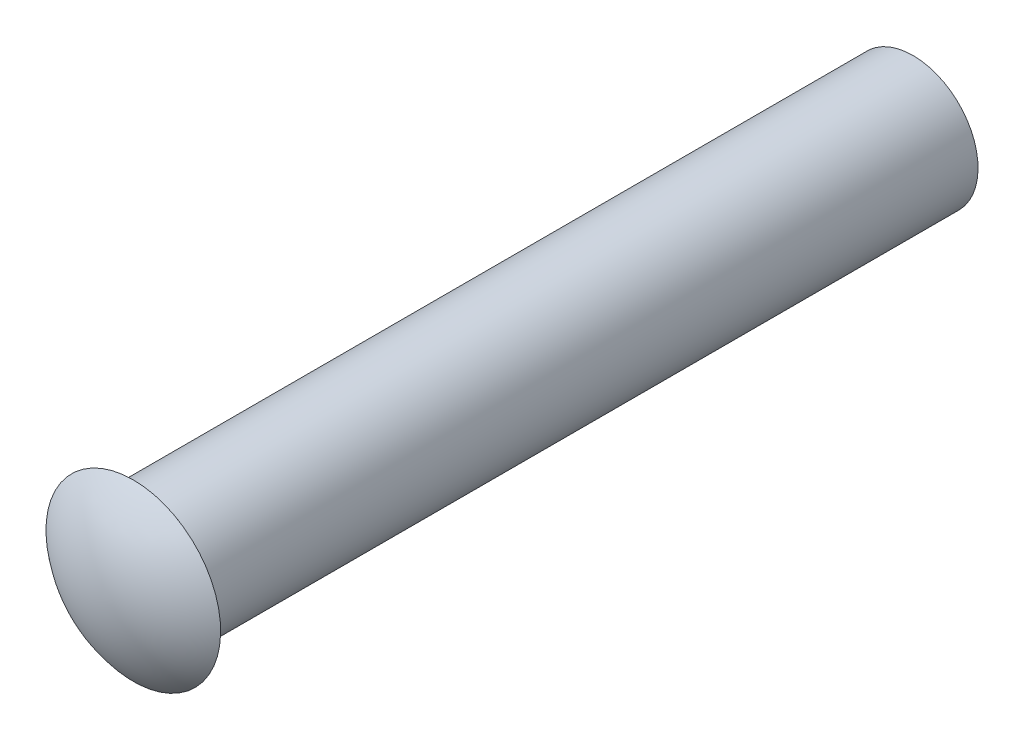
ISO-10303-21;
HEADER;
FILE_DESCRIPTION(('STEP AP214'),'2;1');
FILE_NAME('part.step','',(''),(''),'','','');
FILE_SCHEMA(('AUTOMOTIVE_DESIGN { 1 0 10303 214 1 1 1 1 }'));
ENDSEC;
DATA;
#1=APPLICATION_CONTEXT('core data for automotive mechanical design processes');
#2=APPLICATION_PROTOCOL_DEFINITION('international standard','automotive_design',2000,#1);
#3=PRODUCT_CONTEXT('',#1,'mechanical');
#4=PRODUCT('Part','Part','',(#3));
#5=PRODUCT_RELATED_PRODUCT_CATEGORY('part','',(#4));
#6=PRODUCT_DEFINITION_FORMATION('','',#4);
#7=PRODUCT_DEFINITION_CONTEXT('part definition',#1,'design');
#8=PRODUCT_DEFINITION('design','',#6,#7);
#9=PRODUCT_DEFINITION_SHAPE('','',#8);
#10=(LENGTH_UNIT() NAMED_UNIT(*) SI_UNIT(.MILLI.,.METRE.));
#11=(NAMED_UNIT(*) PLANE_ANGLE_UNIT() SI_UNIT($,.RADIAN.));
#12=(NAMED_UNIT(*) SI_UNIT($,.STERADIAN.) SOLID_ANGLE_UNIT());
#13=UNCERTAINTY_MEASURE_WITH_UNIT(LENGTH_MEASURE(1.E-05),#10,'distance_accuracy_value','');
#14=(GEOMETRIC_REPRESENTATION_CONTEXT(3) GLOBAL_UNCERTAINTY_ASSIGNED_CONTEXT((#13)) GLOBAL_UNIT_ASSIGNED_CONTEXT((#10,
#11,#12)) REPRESENTATION_CONTEXT('',''));
#15=CARTESIAN_POINT('',(0.,0.,0.));
#16=DIRECTION('',(0.,0.,1.));
#17=DIRECTION('',(1.,0.,0.));
#18=AXIS2_PLACEMENT_3D('',#15,#16,#17);
#19=CARTESIAN_POINT('',(0.,1.5875,-19.8374));
#20=DIRECTION('',(0.,0.,-1.));
#21=DIRECTION('',(0.,1.,0.));
#22=AXIS2_PLACEMENT_3D('',#19,#20,#21);
#23=PLANE('',#22);
#24=CARTESIAN_POINT('',(0.,0.,-19.8374));
#25=DIRECTION('',(0.,0.,-1.));
#26=DIRECTION('',(0.,1.,0.));
#27=AXIS2_PLACEMENT_3D('',#24,#25,#26);
#28=CIRCLE('',#27,1.5875);
#29=CARTESIAN_POINT('',(0.,1.5875,-19.8374));
#30=VERTEX_POINT('',#29);
#31=EDGE_CURVE('E47',#30,#30,#28,.T.);
#32=ORIENTED_EDGE('',*,*,#31,.T.);
#33=EDGE_LOOP('',(#32));
#34=FACE_BOUND('',#33,.T.);
#35=ADVANCED_FACE('F37',(#34),#23,.T.);
#36=CARTESIAN_POINT('',(0.,0.,-3.28438387096774));
#37=DIRECTION('',(0.,0.,-1.));
#38=DIRECTION('',(0.,1.,0.));
#39=AXIS2_PLACEMENT_3D('',#36,#37,#38);
#40=SPHERICAL_SURFACE('',#39,3.28438387096774);
#41=CARTESIAN_POINT('',(0.,0.,-0.787400000000001));
#42=DIRECTION('',(0.,0.,-1.));
#43=DIRECTION('',(0.,1.,0.));
#44=AXIS2_PLACEMENT_3D('',#41,#42,#43);
#45=CIRCLE('',#44,2.1336);
#46=CARTESIAN_POINT('',(0.,2.1336,-0.787400000000001));
#47=VERTEX_POINT('',#46);
#48=EDGE_CURVE('E10',#47,#47,#45,.T.);
#49=ORIENTED_EDGE('',*,*,#48,.F.);
#50=EDGE_LOOP('',(#49));
#51=FACE_BOUND('',#50,.T.);
#52=ADVANCED_FACE('F62',(#51),#40,.T.);
#53=CARTESIAN_POINT('',(0.,2.1336,-0.7874));
#54=DIRECTION('',(0.,0.,-1.));
#55=DIRECTION('',(0.,1.,0.));
#56=AXIS2_PLACEMENT_3D('',#53,#54,#55);
#57=PLANE('',#56);
#58=ORIENTED_EDGE('',*,*,#48,.T.);
#59=EDGE_LOOP('',(#58));
#60=FACE_BOUND('',#59,.T.);
#61=CARTESIAN_POINT('',(0.,0.,-0.787400000000001));
#62=DIRECTION('',(0.,0.,-1.));
#63=DIRECTION('',(0.,1.,0.));
#64=AXIS2_PLACEMENT_3D('',#61,#62,#63);
#65=CIRCLE('',#64,1.5875);
#66=CARTESIAN_POINT('',(0.,1.5875,-0.787400000000001));
#67=VERTEX_POINT('',#66);
#68=EDGE_CURVE('E43',#67,#67,#65,.T.);
#69=ORIENTED_EDGE('',*,*,#68,.F.);
#70=EDGE_LOOP('',(#69));
#71=FACE_BOUND('',#70,.T.);
#72=ADVANCED_FACE('F57',(#60,#71),#57,.T.);
#73=CARTESIAN_POINT('',(0.,0.,-19.8374));
#74=DIRECTION('',(0.,0.,-1.));
#75=DIRECTION('',(0.,1.,0.));
#76=AXIS2_PLACEMENT_3D('',#73,#74,#75);
#77=CYLINDRICAL_SURFACE('',#76,1.5875);
#78=ORIENTED_EDGE('',*,*,#68,.T.);
#79=EDGE_LOOP('',(#78));
#80=FACE_BOUND('',#79,.T.);
#81=ORIENTED_EDGE('',*,*,#31,.F.);
#82=EDGE_LOOP('',(#81));
#83=FACE_BOUND('',#82,.T.);
#84=ADVANCED_FACE('F55',(#80,#83),#77,.T.);
#85=CLOSED_SHELL('',(#35,#52,#72,#84));
#86=MANIFOLD_SOLID_BREP('B2',#85);
#87=ADVANCED_BREP_SHAPE_REPRESENTATION('',(#18,#86),#14);
#88=SHAPE_DEFINITION_REPRESENTATION(#9,#87);
ENDSEC;
END-ISO-10303-21;
